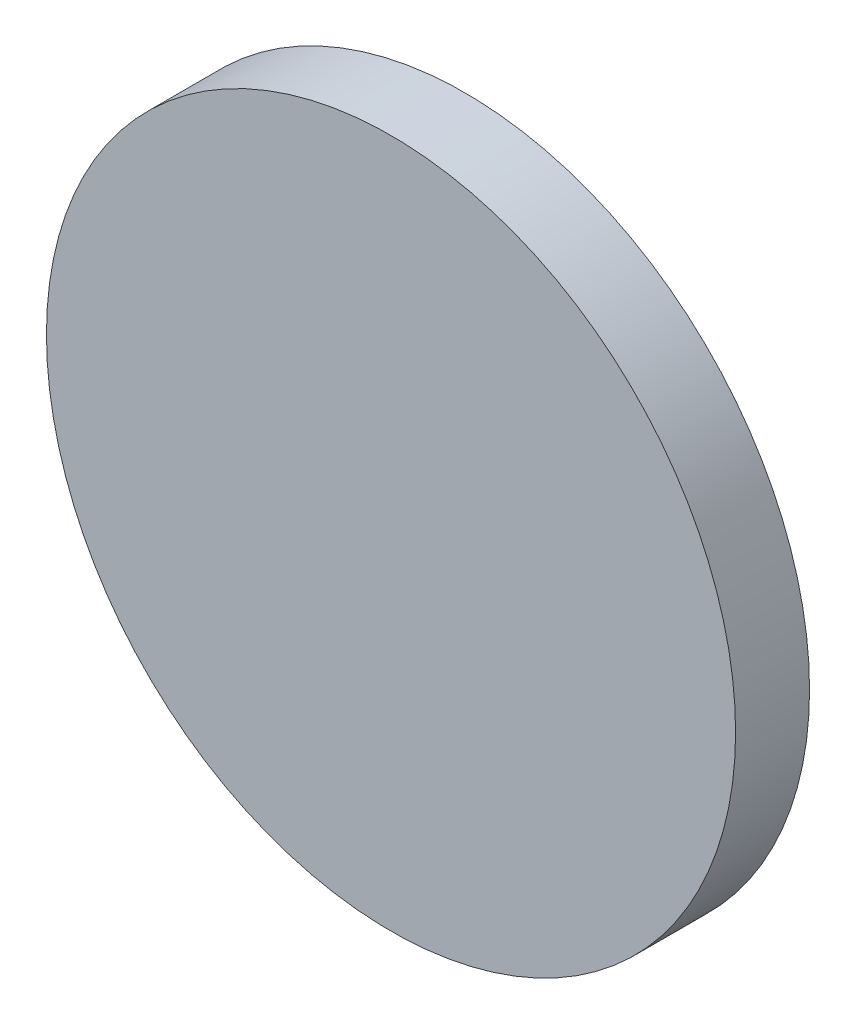
ISO-10303-21;
HEADER;
FILE_DESCRIPTION(('STEP AP214'),'2;1');
FILE_NAME('part.step','',(''),(''),'','','');
FILE_SCHEMA(('AUTOMOTIVE_DESIGN { 1 0 10303 214 1 1 1 1 }'));
ENDSEC;
DATA;
#1=APPLICATION_CONTEXT('core data for automotive mechanical design processes');
#2=APPLICATION_PROTOCOL_DEFINITION('international standard','automotive_design',2000,#1);
#3=PRODUCT_CONTEXT('',#1,'mechanical');
#4=PRODUCT('Part','Part','',(#3));
#5=PRODUCT_RELATED_PRODUCT_CATEGORY('part','',(#4));
#6=PRODUCT_DEFINITION_FORMATION('','',#4);
#7=PRODUCT_DEFINITION_CONTEXT('part definition',#1,'design');
#8=PRODUCT_DEFINITION('design','',#6,#7);
#9=PRODUCT_DEFINITION_SHAPE('','',#8);
#10=(LENGTH_UNIT() NAMED_UNIT(*) SI_UNIT(.MILLI.,.METRE.));
#11=(NAMED_UNIT(*) PLANE_ANGLE_UNIT() SI_UNIT($,.RADIAN.));
#12=(NAMED_UNIT(*) SI_UNIT($,.STERADIAN.) SOLID_ANGLE_UNIT());
#13=UNCERTAINTY_MEASURE_WITH_UNIT(LENGTH_MEASURE(1.E-05),#10,'distance_accuracy_value','');
#14=(GEOMETRIC_REPRESENTATION_CONTEXT(3) GLOBAL_UNCERTAINTY_ASSIGNED_CONTEXT((#13)) GLOBAL_UNIT_ASSIGNED_CONTEXT((#10,
#11,#12)) REPRESENTATION_CONTEXT('',''));
#15=CARTESIAN_POINT('',(0.,0.,0.));
#16=DIRECTION('',(0.,0.,1.));
#17=DIRECTION('',(1.,0.,0.));
#18=AXIS2_PLACEMENT_3D('',#15,#16,#17);
#19=CARTESIAN_POINT('',(0.,0.,0.0762));
#20=DIRECTION('',(0.,0.,1.));
#21=DIRECTION('',(1.,0.,0.));
#22=AXIS2_PLACEMENT_3D('',#19,#20,#21);
#23=PLANE('',#22);
#24=CARTESIAN_POINT('',(0.,0.,0.0762));
#25=DIRECTION('',(0.,0.,1.));
#26=DIRECTION('',(1.,0.,0.));
#27=AXIS2_PLACEMENT_3D('',#24,#25,#26);
#28=CIRCLE('',#27,0.355);
#29=CARTESIAN_POINT('',(0.355,0.,0.0762));
#30=VERTEX_POINT('',#29);
#31=EDGE_CURVE('E18',#30,#30,#28,.F.);
#32=ORIENTED_EDGE('',*,*,#31,.F.);
#33=EDGE_LOOP('',(#32));
#34=FACE_BOUND('',#33,.T.);
#35=ADVANCED_FACE('F15',(#34),#23,.T.);
#36=CARTESIAN_POINT('',(0.,0.,0.));
#37=DIRECTION('',(0.,0.,1.));
#38=DIRECTION('',(1.,0.,0.));
#39=AXIS2_PLACEMENT_3D('',#36,#37,#38);
#40=CYLINDRICAL_SURFACE('',#39,0.355);
#41=ORIENTED_EDGE('',*,*,#31,.T.);
#42=EDGE_LOOP('',(#41));
#43=FACE_BOUND('',#42,.T.);
#44=CARTESIAN_POINT('',(0.,0.,0.));
#45=DIRECTION('',(0.,0.,1.));
#46=DIRECTION('',(1.,0.,0.));
#47=AXIS2_PLACEMENT_3D('',#44,#45,#46);
#48=CIRCLE('',#47,0.355);
#49=CARTESIAN_POINT('',(0.355,0.,0.));
#50=VERTEX_POINT('',#49);
#51=EDGE_CURVE('E10',#50,#50,#48,.T.);
#52=ORIENTED_EDGE('',*,*,#51,.T.);
#53=EDGE_LOOP('',(#52));
#54=FACE_BOUND('',#53,.T.);
#55=ADVANCED_FACE('F27',(#43,#54),#40,.T.);
#56=CARTESIAN_POINT('',(0.,0.,0.));
#57=DIRECTION('',(0.,0.,1.));
#58=DIRECTION('',(1.,0.,0.));
#59=AXIS2_PLACEMENT_3D('',#56,#57,#58);
#60=PLANE('',#59);
#61=ORIENTED_EDGE('',*,*,#51,.F.);
#62=EDGE_LOOP('',(#61));
#63=FACE_BOUND('',#62,.T.);
#64=ADVANCED_FACE('F34',(#63),#60,.F.);
#65=CLOSED_SHELL('',(#35,#55,#64));
#66=MANIFOLD_SOLID_BREP('B1',#65);
#67=ADVANCED_BREP_SHAPE_REPRESENTATION('',(#18,#66),#14);
#68=SHAPE_DEFINITION_REPRESENTATION(#9,#67);
ENDSEC;
END-ISO-10303-21;
